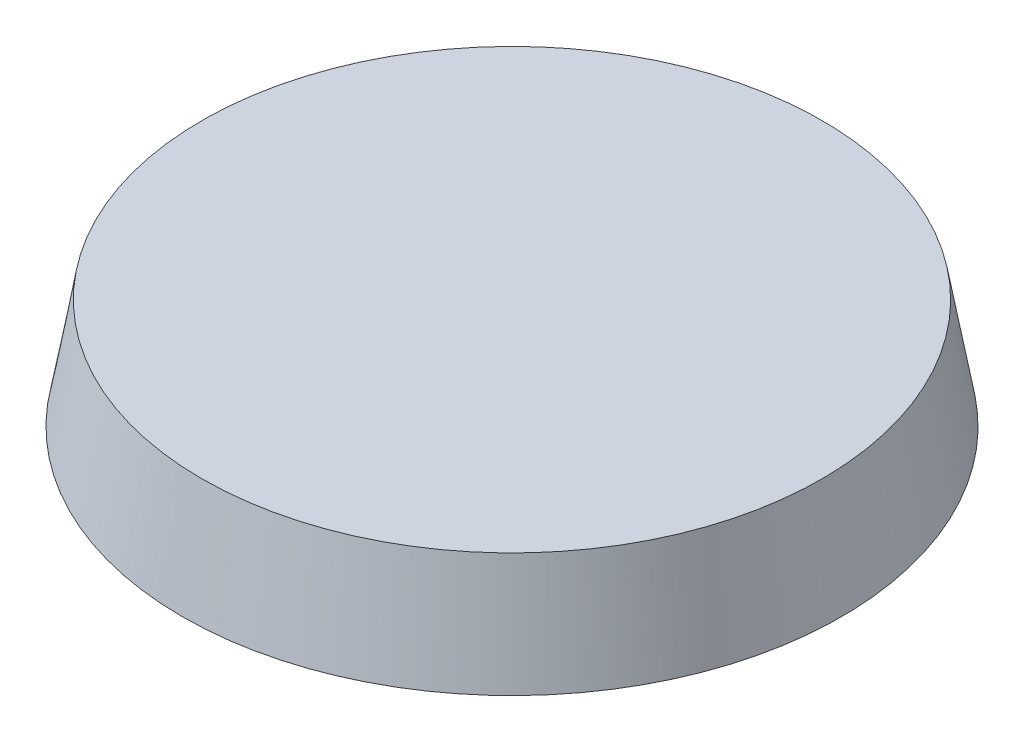
ISO-10303-21;
HEADER;
FILE_DESCRIPTION(('STEP AP214'),'2;1');
FILE_NAME('part.step','',(''),(''),'','','');
FILE_SCHEMA(('AUTOMOTIVE_DESIGN { 1 0 10303 214 1 1 1 1 }'));
ENDSEC;
DATA;
#1=APPLICATION_CONTEXT('core data for automotive mechanical design processes');
#2=APPLICATION_PROTOCOL_DEFINITION('international standard','automotive_design',2000,#1);
#3=PRODUCT_CONTEXT('',#1,'mechanical');
#4=PRODUCT('Part','Part','',(#3));
#5=PRODUCT_RELATED_PRODUCT_CATEGORY('part','',(#4));
#6=PRODUCT_DEFINITION_FORMATION('','',#4);
#7=PRODUCT_DEFINITION_CONTEXT('part definition',#1,'design');
#8=PRODUCT_DEFINITION('design','',#6,#7);
#9=PRODUCT_DEFINITION_SHAPE('','',#8);
#10=(LENGTH_UNIT() NAMED_UNIT(*) SI_UNIT(.MILLI.,.METRE.));
#11=(NAMED_UNIT(*) PLANE_ANGLE_UNIT() SI_UNIT($,.RADIAN.));
#12=(NAMED_UNIT(*) SI_UNIT($,.STERADIAN.) SOLID_ANGLE_UNIT());
#13=UNCERTAINTY_MEASURE_WITH_UNIT(LENGTH_MEASURE(1.E-05),#10,'distance_accuracy_value','');
#14=(GEOMETRIC_REPRESENTATION_CONTEXT(3) GLOBAL_UNCERTAINTY_ASSIGNED_CONTEXT((#13)) GLOBAL_UNIT_ASSIGNED_CONTEXT((#10,
#11,#12)) REPRESENTATION_CONTEXT('',''));
#15=CARTESIAN_POINT('',(0.,0.,0.));
#16=DIRECTION('',(0.,0.,1.));
#17=DIRECTION('',(1.,0.,0.));
#18=AXIS2_PLACEMENT_3D('',#15,#16,#17);
#19=CARTESIAN_POINT('',(0.,0.,0.));
#20=DIRECTION('',(0.,-1.,0.));
#21=DIRECTION('',(0.,0.,1.));
#22=AXIS2_PLACEMENT_3D('',#19,#20,#21);
#23=CONICAL_SURFACE('',#22,150.,0.174532925199433);
#24=CARTESIAN_POINT('',(0.,50.,0.));
#25=DIRECTION('',(0.,1.,0.));
#26=DIRECTION('',(0.,0.,1.));
#27=AXIS2_PLACEMENT_3D('',#24,#25,#26);
#28=CIRCLE('',#27,141.183650964577);
#29=CARTESIAN_POINT('',(0.,50.,141.183650964577));
#30=VERTEX_POINT('',#29);
#31=EDGE_CURVE('E10',#30,#30,#28,.T.);
#32=ORIENTED_EDGE('',*,*,#31,.F.);
#33=EDGE_LOOP('',(#32));
#34=FACE_BOUND('',#33,.T.);
#35=CARTESIAN_POINT('',(0.,0.,0.));
#36=DIRECTION('',(0.,1.,0.));
#37=DIRECTION('',(0.,0.,1.));
#38=AXIS2_PLACEMENT_3D('',#35,#36,#37);
#39=CIRCLE('',#38,150.);
#40=CARTESIAN_POINT('',(0.,0.,150.));
#41=VERTEX_POINT('',#40);
#42=EDGE_CURVE('E38',#41,#41,#39,.T.);
#43=ORIENTED_EDGE('',*,*,#42,.T.);
#44=EDGE_LOOP('',(#43));
#45=FACE_BOUND('',#44,.T.);
#46=ADVANCED_FACE('F32',(#34,#45),#23,.T.);
#47=CARTESIAN_POINT('',(0.,50.,0.));
#48=DIRECTION('',(0.,1.,0.));
#49=DIRECTION('',(0.,0.,1.));
#50=AXIS2_PLACEMENT_3D('',#47,#48,#49);
#51=PLANE('',#50);
#52=ORIENTED_EDGE('',*,*,#31,.T.);
#53=EDGE_LOOP('',(#52));
#54=FACE_BOUND('',#53,.T.);
#55=ADVANCED_FACE('F47',(#54),#51,.T.);
#56=CARTESIAN_POINT('',(0.,0.,0.));
#57=DIRECTION('',(0.,1.,0.));
#58=DIRECTION('',(0.,0.,1.));
#59=AXIS2_PLACEMENT_3D('',#56,#57,#58);
#60=PLANE('',#59);
#61=ORIENTED_EDGE('',*,*,#42,.F.);
#62=EDGE_LOOP('',(#61));
#63=FACE_BOUND('',#62,.T.);
#64=ADVANCED_FACE('F45',(#63),#60,.F.);
#65=CLOSED_SHELL('',(#46,#55,#64));
#66=MANIFOLD_SOLID_BREP('B2',#65);
#67=ADVANCED_BREP_SHAPE_REPRESENTATION('',(#18,#66),#14);
#68=SHAPE_DEFINITION_REPRESENTATION(#9,#67);
ENDSEC;
END-ISO-10303-21;
